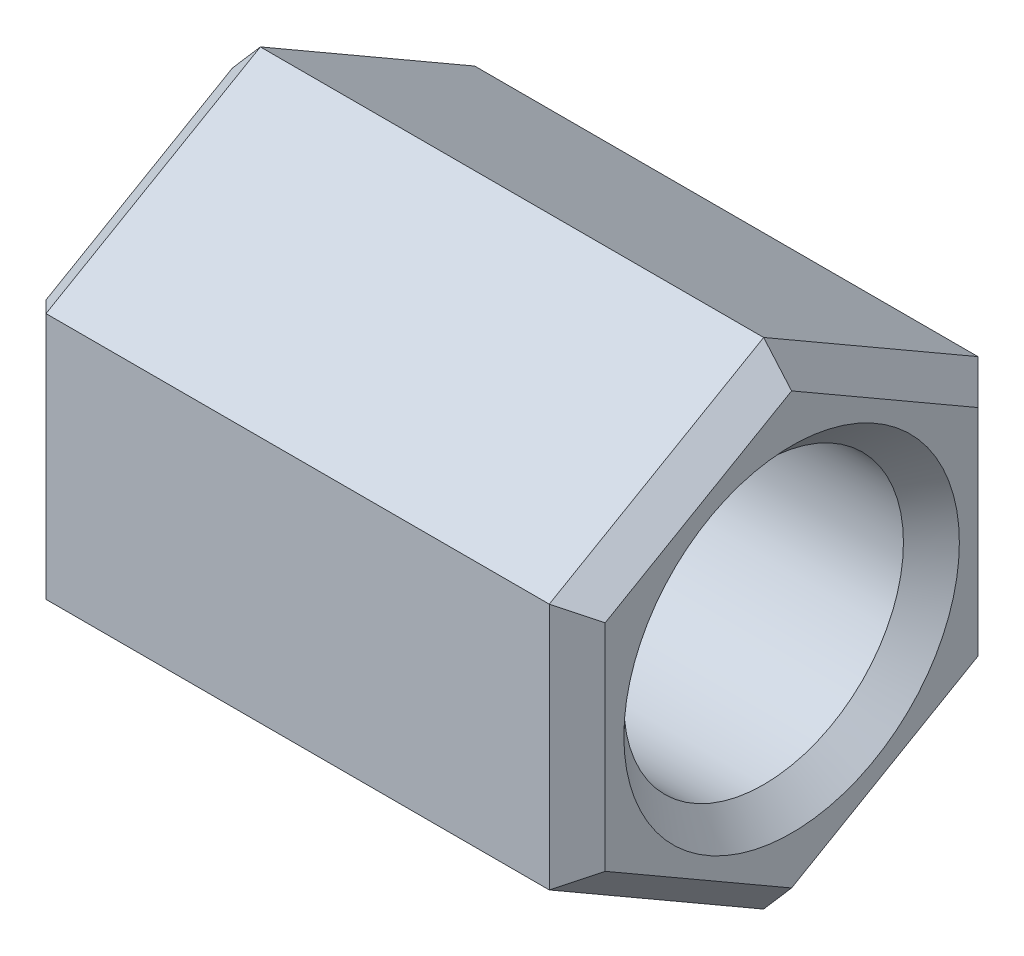
ISO-10303-21;
HEADER;
FILE_DESCRIPTION(('STEP AP214'),'2;1');
FILE_NAME('part.step','',(''),(''),'','','');
FILE_SCHEMA(('AUTOMOTIVE_DESIGN { 1 0 10303 214 1 1 1 1 }'));
ENDSEC;
DATA;
#1=APPLICATION_CONTEXT('core data for automotive mechanical design processes');
#2=APPLICATION_PROTOCOL_DEFINITION('international standard','automotive_design',2000,#1);
#3=PRODUCT_CONTEXT('',#1,'mechanical');
#4=PRODUCT('Part','Part','',(#3));
#5=PRODUCT_RELATED_PRODUCT_CATEGORY('part','',(#4));
#6=PRODUCT_DEFINITION_FORMATION('','',#4);
#7=PRODUCT_DEFINITION_CONTEXT('part definition',#1,'design');
#8=PRODUCT_DEFINITION('design','',#6,#7);
#9=PRODUCT_DEFINITION_SHAPE('','',#8);
#10=(LENGTH_UNIT() NAMED_UNIT(*) SI_UNIT(.MILLI.,.METRE.));
#11=(NAMED_UNIT(*) PLANE_ANGLE_UNIT() SI_UNIT($,.RADIAN.));
#12=(NAMED_UNIT(*) SI_UNIT($,.STERADIAN.) SOLID_ANGLE_UNIT());
#13=UNCERTAINTY_MEASURE_WITH_UNIT(LENGTH_MEASURE(1.E-05),#10,'distance_accuracy_value','');
#14=(GEOMETRIC_REPRESENTATION_CONTEXT(3) GLOBAL_UNCERTAINTY_ASSIGNED_CONTEXT((#13)) GLOBAL_UNIT_ASSIGNED_CONTEXT((#10,
#11,#12)) REPRESENTATION_CONTEXT('',''));
#15=CARTESIAN_POINT('',(0.,0.,0.));
#16=DIRECTION('',(0.,0.,1.));
#17=DIRECTION('',(1.,0.,0.));
#18=AXIS2_PLACEMENT_3D('',#15,#16,#17);
#19=CARTESIAN_POINT('',(6.,0.,0.));
#20=DIRECTION('',(1.,0.,0.));
#21=DIRECTION('',(0.,0.,-1.));
#22=AXIS2_PLACEMENT_3D('',#19,#20,#21);
#23=PLANE('',#22);
#24=CARTESIAN_POINT('',(6.,0.,0.));
#25=DIRECTION('',(1.,0.,0.));
#26=DIRECTION('',(0.,0.,-1.));
#27=AXIS2_PLACEMENT_3D('',#24,#25,#26);
#28=CIRCLE('',#27,1.8);
#29=CARTESIAN_POINT('',(6.,0.,-1.8));
#30=VERTEX_POINT('',#29);
#31=EDGE_CURVE('E11',#30,#30,#28,.F.);
#32=ORIENTED_EDGE('',*,*,#31,.T.);
#33=EDGE_LOOP('',(#32));
#34=FACE_BOUND('',#33,.T.);
#35=DIRECTION('',(0.,0.5,-0.866025403784439));
#36=VECTOR('',#35,1.);
#37=CARTESIAN_POINT('',(6.,-1.06809799800081,-2.15));
#38=LINE('',#37,#36);
#39=CARTESIAN_POINT('',(6.,-2.3094010767585,0.));
#40=VERTEX_POINT('',#39);
#41=CARTESIAN_POINT('',(6.,-1.15470053837925,-2.));
#42=VERTEX_POINT('',#41);
#43=EDGE_CURVE('E63',#40,#42,#38,.T.);
#44=ORIENTED_EDGE('',*,*,#43,.T.);
#45=DIRECTION('',(0.,1.,0.));
#46=VECTOR('',#45,1.);
#47=CARTESIAN_POINT('',(6.,1.32790561913614,-2.));
#48=LINE('',#47,#46);
#49=CARTESIAN_POINT('',(6.,1.15470053837925,-2.));
#50=VERTEX_POINT('',#49);
#51=EDGE_CURVE('E55',#42,#50,#48,.T.);
#52=ORIENTED_EDGE('',*,*,#51,.T.);
#53=DIRECTION('',(0.,0.5,0.866025403784439));
#54=VECTOR('',#53,1.);
#55=CARTESIAN_POINT('',(6.,2.39600361713695,0.15));
#56=LINE('',#55,#54);
#57=CARTESIAN_POINT('',(6.,2.30940107675851,0.));
#58=VERTEX_POINT('',#57);
#59=EDGE_CURVE('E202',#50,#58,#56,.T.);
#60=ORIENTED_EDGE('',*,*,#59,.T.);
#61=DIRECTION('',(0.,-0.5,0.866025403784438));
#62=VECTOR('',#61,1.);
#63=CARTESIAN_POINT('',(6.,1.06809799800081,2.15));
#64=LINE('',#63,#62);
#65=CARTESIAN_POINT('',(6.,1.15470053837925,2.));
#66=VERTEX_POINT('',#65);
#67=EDGE_CURVE('E204',#58,#66,#64,.T.);
#68=ORIENTED_EDGE('',*,*,#67,.T.);
#69=DIRECTION('',(0.,-1.,0.));
#70=VECTOR('',#69,1.);
#71=CARTESIAN_POINT('',(6.,-1.32790561913614,2.));
#72=LINE('',#71,#70);
#73=CARTESIAN_POINT('',(6.,-1.15470053837925,2.));
#74=VERTEX_POINT('',#73);
#75=EDGE_CURVE('E206',#66,#74,#72,.T.);
#76=ORIENTED_EDGE('',*,*,#75,.T.);
#77=DIRECTION('',(0.,-0.5,-0.866025403784439));
#78=VECTOR('',#77,1.);
#79=CARTESIAN_POINT('',(6.,-2.39600361713695,-0.149999999999998));
#80=LINE('',#79,#78);
#81=EDGE_CURVE('E68',#74,#40,#80,.T.);
#82=ORIENTED_EDGE('',*,*,#81,.T.);
#83=EDGE_LOOP('',(#44,#52,#60,#68,#76,#82));
#84=FACE_BOUND('',#83,.T.);
#85=ADVANCED_FACE('F45',(#34,#84),#23,.T.);
#86=CARTESIAN_POINT('',(0.,0.,0.));
#87=DIRECTION('',(1.,0.,0.));
#88=DIRECTION('',(0.,0.,-1.));
#89=AXIS2_PLACEMENT_3D('',#86,#87,#88);
#90=PLANE('',#89);
#91=CARTESIAN_POINT('',(0.,0.,0.));
#92=DIRECTION('',(1.,0.,0.));
#93=DIRECTION('',(0.,0.,-1.));
#94=AXIS2_PLACEMENT_3D('',#91,#92,#93);
#95=CIRCLE('',#94,1.8);
#96=CARTESIAN_POINT('',(0.,0.,-1.8));
#97=VERTEX_POINT('',#96);
#98=EDGE_CURVE('E164',#97,#97,#95,.T.);
#99=ORIENTED_EDGE('',*,*,#98,.T.);
#100=EDGE_LOOP('',(#99));
#101=FACE_BOUND('',#100,.T.);
#102=DIRECTION('',(0.,1.,0.));
#103=VECTOR('',#102,1.);
#104=CARTESIAN_POINT('',(0.,0.,2.));
#105=LINE('',#104,#103);
#106=CARTESIAN_POINT('',(0.,-1.15470053837925,2.));
#107=VERTEX_POINT('',#106);
#108=CARTESIAN_POINT('',(0.,1.15470053837925,2.));
#109=VERTEX_POINT('',#108);
#110=EDGE_CURVE('E163',#107,#109,#105,.T.);
#111=ORIENTED_EDGE('',*,*,#110,.T.);
#112=DIRECTION('',(0.,0.5,-0.866025403784438));
#113=VECTOR('',#112,1.);
#114=CARTESIAN_POINT('',(0.,1.73205080756888,1.));
#115=LINE('',#114,#113);
#116=CARTESIAN_POINT('',(0.,2.3094010767585,0.));
#117=VERTEX_POINT('',#116);
#118=EDGE_CURVE('E142',#109,#117,#115,.T.);
#119=ORIENTED_EDGE('',*,*,#118,.T.);
#120=DIRECTION('',(0.,-0.5,-0.866025403784439));
#121=VECTOR('',#120,1.);
#122=CARTESIAN_POINT('',(0.,1.73205080756888,-1.));
#123=LINE('',#122,#121);
#124=CARTESIAN_POINT('',(0.,1.15470053837925,-2.));
#125=VERTEX_POINT('',#124);
#126=EDGE_CURVE('E152',#117,#125,#123,.T.);
#127=ORIENTED_EDGE('',*,*,#126,.T.);
#128=DIRECTION('',(0.,-1.,0.));
#129=VECTOR('',#128,1.);
#130=CARTESIAN_POINT('',(0.,0.,-2.));
#131=LINE('',#130,#129);
#132=CARTESIAN_POINT('',(0.,-1.15470053837925,-2.));
#133=VERTEX_POINT('',#132);
#134=EDGE_CURVE('E158',#125,#133,#131,.T.);
#135=ORIENTED_EDGE('',*,*,#134,.T.);
#136=DIRECTION('',(0.,-0.5,0.866025403784439));
#137=VECTOR('',#136,1.);
#138=CARTESIAN_POINT('',(0.,-1.73205080756888,-0.999999999999999));
#139=LINE('',#138,#137);
#140=CARTESIAN_POINT('',(0.,-2.3094010767585,0.));
#141=VERTEX_POINT('',#140);
#142=EDGE_CURVE('E264',#133,#141,#139,.T.);
#143=ORIENTED_EDGE('',*,*,#142,.T.);
#144=DIRECTION('',(0.,0.5,0.866025403784439));
#145=VECTOR('',#144,1.);
#146=CARTESIAN_POINT('',(0.,-1.73205080756888,1.));
#147=LINE('',#146,#145);
#148=EDGE_CURVE('E169',#141,#107,#147,.T.);
#149=ORIENTED_EDGE('',*,*,#148,.T.);
#150=EDGE_LOOP('',(#111,#119,#127,#135,#143,#149));
#151=FACE_BOUND('',#150,.T.);
#152=ADVANCED_FACE('F161',(#101,#151),#90,.F.);
#153=CARTESIAN_POINT('',(6.,1.32790561913614,-2.3));
#154=DIRECTION('',(0.,-0.866025403784439,0.5));
#155=DIRECTION('',(0.,-0.5,-0.866025403784439));
#156=AXIS2_PLACEMENT_3D('',#153,#154,#155);
#157=PLANE('',#156);
#158=DIRECTION('',(-1.,0.,0.));
#159=VECTOR('',#158,1.);
#160=CARTESIAN_POINT('',(6.,1.32790561913614,-2.3));
#161=LINE('',#160,#159);
#162=CARTESIAN_POINT('',(5.7,1.32790561913614,-2.3));
#163=VERTEX_POINT('',#162);
#164=CARTESIAN_POINT('',(0.3,1.32790561913614,-2.3));
#165=VERTEX_POINT('',#164);
#166=EDGE_CURVE('E221',#163,#165,#161,.T.);
#167=ORIENTED_EDGE('',*,*,#166,.T.);
#168=DIRECTION('',(0.,0.5,0.866025403784439));
#169=VECTOR('',#168,1.);
#170=CARTESIAN_POINT('',(0.3,1.32790561913614,-2.3));
#171=LINE('',#170,#169);
#172=CARTESIAN_POINT('',(0.3,2.65581123827228,0.));
#173=VERTEX_POINT('',#172);
#174=EDGE_CURVE('E200',#165,#173,#171,.T.);
#175=ORIENTED_EDGE('',*,*,#174,.T.);
#176=DIRECTION('',(-1.,0.,0.));
#177=VECTOR('',#176,1.);
#178=CARTESIAN_POINT('',(6.,2.65581123827228,0.));
#179=LINE('',#178,#177);
#180=CARTESIAN_POINT('',(5.7,2.65581123827228,0.));
#181=VERTEX_POINT('',#180);
#182=EDGE_CURVE('E159',#181,#173,#179,.T.);
#183=ORIENTED_EDGE('',*,*,#182,.F.);
#184=DIRECTION('',(0.,-0.5,-0.866025403784439));
#185=VECTOR('',#184,1.);
#186=CARTESIAN_POINT('',(5.7,1.32790561913614,-2.3));
#187=LINE('',#186,#185);
#188=EDGE_CURVE('E198',#181,#163,#187,.T.);
#189=ORIENTED_EDGE('',*,*,#188,.T.);
#190=EDGE_LOOP('',(#167,#175,#183,#189));
#191=FACE_BOUND('',#190,.T.);
#192=ADVANCED_FACE('F288',(#191),#157,.F.);
#193=CARTESIAN_POINT('',(6.,2.65581123827228,0.));
#194=DIRECTION('',(0.,-0.866025403784438,-0.5));
#195=DIRECTION('',(0.,0.5,-0.866025403784439));
#196=AXIS2_PLACEMENT_3D('',#193,#194,#195);
#197=PLANE('',#196);
#198=ORIENTED_EDGE('',*,*,#182,.T.);
#199=DIRECTION('',(0.,-0.5,0.866025403784439));
#200=VECTOR('',#199,1.);
#201=CARTESIAN_POINT('',(0.3,2.65581123827228,0.));
#202=LINE('',#201,#200);
#203=CARTESIAN_POINT('',(0.3,1.32790561913614,2.3));
#204=VERTEX_POINT('',#203);
#205=EDGE_CURVE('E145',#173,#204,#202,.T.);
#206=ORIENTED_EDGE('',*,*,#205,.T.);
#207=DIRECTION('',(-1.,0.,0.));
#208=VECTOR('',#207,1.);
#209=CARTESIAN_POINT('',(6.,1.32790561913614,2.3));
#210=LINE('',#209,#208);
#211=CARTESIAN_POINT('',(5.7,1.32790561913614,2.3));
#212=VERTEX_POINT('',#211);
#213=EDGE_CURVE('E250',#212,#204,#210,.T.);
#214=ORIENTED_EDGE('',*,*,#213,.F.);
#215=DIRECTION('',(0.,0.5,-0.866025403784439));
#216=VECTOR('',#215,1.);
#217=CARTESIAN_POINT('',(5.7,2.65581123827228,0.));
#218=LINE('',#217,#216);
#219=EDGE_CURVE('E178',#212,#181,#218,.T.);
#220=ORIENTED_EDGE('',*,*,#219,.T.);
#221=EDGE_LOOP('',(#198,#206,#214,#220));
#222=FACE_BOUND('',#221,.T.);
#223=ADVANCED_FACE('F255',(#222),#197,.F.);
#224=CARTESIAN_POINT('',(6.,1.32790561913614,2.3));
#225=DIRECTION('',(0.,0.,-1.));
#226=DIRECTION('',(0.,1.,0.));
#227=AXIS2_PLACEMENT_3D('',#224,#225,#226);
#228=PLANE('',#227);
#229=ORIENTED_EDGE('',*,*,#213,.T.);
#230=DIRECTION('',(0.,-1.,0.));
#231=VECTOR('',#230,1.);
#232=CARTESIAN_POINT('',(0.3,1.32790561913614,2.3));
#233=LINE('',#232,#231);
#234=CARTESIAN_POINT('',(0.3,-1.32790561913614,2.3));
#235=VERTEX_POINT('',#234);
#236=EDGE_CURVE('E183',#204,#235,#233,.T.);
#237=ORIENTED_EDGE('',*,*,#236,.T.);
#238=DIRECTION('',(-1.,0.,0.));
#239=VECTOR('',#238,1.);
#240=CARTESIAN_POINT('',(6.,-1.32790561913614,2.3));
#241=LINE('',#240,#239);
#242=CARTESIAN_POINT('',(5.7,-1.32790561913614,2.3));
#243=VERTEX_POINT('',#242);
#244=EDGE_CURVE('E252',#243,#235,#241,.T.);
#245=ORIENTED_EDGE('',*,*,#244,.F.);
#246=DIRECTION('',(0.,1.,0.));
#247=VECTOR('',#246,1.);
#248=CARTESIAN_POINT('',(5.7,1.32790561913614,2.3));
#249=LINE('',#248,#247);
#250=EDGE_CURVE('E181',#243,#212,#249,.T.);
#251=ORIENTED_EDGE('',*,*,#250,.T.);
#252=EDGE_LOOP('',(#229,#237,#245,#251));
#253=FACE_BOUND('',#252,.T.);
#254=ADVANCED_FACE('F249',(#253),#228,.F.);
#255=CARTESIAN_POINT('',(6.,-1.32790561913614,2.3));
#256=DIRECTION('',(0.,0.866025403784439,-0.5));
#257=DIRECTION('',(0.,0.5,0.866025403784439));
#258=AXIS2_PLACEMENT_3D('',#255,#256,#257);
#259=PLANE('',#258);
#260=ORIENTED_EDGE('',*,*,#244,.T.);
#261=DIRECTION('',(0.,-0.5,-0.866025403784439));
#262=VECTOR('',#261,1.);
#263=CARTESIAN_POINT('',(0.3,-1.32790561913614,2.3));
#264=LINE('',#263,#262);
#265=CARTESIAN_POINT('',(0.3,-2.65581123827228,0.));
#266=VERTEX_POINT('',#265);
#267=EDGE_CURVE('E187',#235,#266,#264,.T.);
#268=ORIENTED_EDGE('',*,*,#267,.T.);
#269=DIRECTION('',(-1.,0.,0.));
#270=VECTOR('',#269,1.);
#271=CARTESIAN_POINT('',(6.,-2.65581123827228,0.));
#272=LINE('',#271,#270);
#273=CARTESIAN_POINT('',(5.7,-2.65581123827228,0.));
#274=VERTEX_POINT('',#273);
#275=EDGE_CURVE('E259',#274,#266,#272,.T.);
#276=ORIENTED_EDGE('',*,*,#275,.F.);
#277=DIRECTION('',(0.,0.5,0.866025403784439));
#278=VECTOR('',#277,1.);
#279=CARTESIAN_POINT('',(5.7,-1.32790561913614,2.3));
#280=LINE('',#279,#278);
#281=EDGE_CURVE('E185',#274,#243,#280,.T.);
#282=ORIENTED_EDGE('',*,*,#281,.T.);
#283=EDGE_LOOP('',(#260,#268,#276,#282));
#284=FACE_BOUND('',#283,.T.);
#285=ADVANCED_FACE('F276',(#284),#259,.F.);
#286=CARTESIAN_POINT('',(6.,-2.65581123827228,0.));
#287=DIRECTION('',(0.,0.866025403784439,0.5));
#288=DIRECTION('',(0.,-0.5,0.866025403784439));
#289=AXIS2_PLACEMENT_3D('',#286,#287,#288);
#290=PLANE('',#289);
#291=ORIENTED_EDGE('',*,*,#275,.T.);
#292=DIRECTION('',(0.,0.5,-0.866025403784439));
#293=VECTOR('',#292,1.);
#294=CARTESIAN_POINT('',(0.3,-2.65581123827228,0.));
#295=LINE('',#294,#293);
#296=CARTESIAN_POINT('',(0.3,-1.32790561913614,-2.3));
#297=VERTEX_POINT('',#296);
#298=EDGE_CURVE('E191',#266,#297,#295,.T.);
#299=ORIENTED_EDGE('',*,*,#298,.T.);
#300=DIRECTION('',(-1.,0.,0.));
#301=VECTOR('',#300,1.);
#302=CARTESIAN_POINT('',(6.,-1.32790561913614,-2.3));
#303=LINE('',#302,#301);
#304=CARTESIAN_POINT('',(5.7,-1.32790561913614,-2.3));
#305=VERTEX_POINT('',#304);
#306=EDGE_CURVE('E281',#305,#297,#303,.T.);
#307=ORIENTED_EDGE('',*,*,#306,.F.);
#308=DIRECTION('',(0.,-0.5,0.866025403784439));
#309=VECTOR('',#308,1.);
#310=CARTESIAN_POINT('',(5.7,-2.65581123827228,0.));
#311=LINE('',#310,#309);
#312=EDGE_CURVE('E189',#305,#274,#311,.T.);
#313=ORIENTED_EDGE('',*,*,#312,.T.);
#314=EDGE_LOOP('',(#291,#299,#307,#313));
#315=FACE_BOUND('',#314,.T.);
#316=ADVANCED_FACE('F299',(#315),#290,.F.);
#317=CARTESIAN_POINT('',(6.,-1.32790561913614,-2.3));
#318=DIRECTION('',(0.,0.,1.));
#319=DIRECTION('',(1.,0.,0.));
#320=AXIS2_PLACEMENT_3D('',#317,#318,#319);
#321=PLANE('',#320);
#322=ORIENTED_EDGE('',*,*,#306,.T.);
#323=DIRECTION('',(0.,1.,0.));
#324=VECTOR('',#323,1.);
#325=CARTESIAN_POINT('',(0.3,-1.32790561913614,-2.3));
#326=LINE('',#325,#324);
#327=EDGE_CURVE('E196',#297,#165,#326,.T.);
#328=ORIENTED_EDGE('',*,*,#327,.T.);
#329=ORIENTED_EDGE('',*,*,#166,.F.);
#330=DIRECTION('',(0.,-1.,0.));
#331=VECTOR('',#330,1.);
#332=CARTESIAN_POINT('',(5.7,-1.32790561913614,-2.3));
#333=LINE('',#332,#331);
#334=EDGE_CURVE('E193',#163,#305,#333,.T.);
#335=ORIENTED_EDGE('',*,*,#334,.T.);
#336=EDGE_LOOP('',(#322,#328,#329,#335));
#337=FACE_BOUND('',#336,.T.);
#338=ADVANCED_FACE('F300',(#337),#321,.F.);
#339=CARTESIAN_POINT('',(6.,0.,0.));
#340=DIRECTION('',(-1.,0.,0.));
#341=DIRECTION('',(0.,0.,1.));
#342=AXIS2_PLACEMENT_3D('',#339,#340,#341);
#343=CYLINDRICAL_SURFACE('',#342,1.5);
#344=CARTESIAN_POINT('',(0.300000000000002,0.,0.));
#345=DIRECTION('',(1.,0.,0.));
#346=DIRECTION('',(0.,0.,-1.));
#347=AXIS2_PLACEMENT_3D('',#344,#345,#346);
#348=CIRCLE('',#347,1.5);
#349=CARTESIAN_POINT('',(0.300000000000002,0.,-1.5));
#350=VERTEX_POINT('',#349);
#351=EDGE_CURVE('E175',#350,#350,#348,.F.);
#352=ORIENTED_EDGE('',*,*,#351,.T.);
#353=EDGE_LOOP('',(#352));
#354=FACE_BOUND('',#353,.T.);
#355=CARTESIAN_POINT('',(5.7,0.,0.));
#356=DIRECTION('',(1.,0.,0.));
#357=DIRECTION('',(0.,0.,-1.));
#358=AXIS2_PLACEMENT_3D('',#355,#356,#357);
#359=CIRCLE('',#358,1.5);
#360=CARTESIAN_POINT('',(5.7,0.,-1.5));
#361=VERTEX_POINT('',#360);
#362=EDGE_CURVE('E167',#361,#361,#359,.T.);
#363=ORIENTED_EDGE('',*,*,#362,.T.);
#364=EDGE_LOOP('',(#363));
#365=FACE_BOUND('',#364,.T.);
#366=ADVANCED_FACE('F319',(#354,#365),#343,.F.);
#367=CARTESIAN_POINT('',(0.,0.,0.));
#368=DIRECTION('',(-1.,0.,0.));
#369=DIRECTION('',(0.,0.,1.));
#370=AXIS2_PLACEMENT_3D('',#367,#368,#369);
#371=CONICAL_SURFACE('',#370,1.8,0.785398163397446);
#372=ORIENTED_EDGE('',*,*,#351,.F.);
#373=EDGE_LOOP('',(#372));
#374=FACE_BOUND('',#373,.T.);
#375=ORIENTED_EDGE('',*,*,#98,.F.);
#376=EDGE_LOOP('',(#375));
#377=FACE_BOUND('',#376,.T.);
#378=ADVANCED_FACE('F334',(#374,#377),#371,.F.);
#379=CARTESIAN_POINT('',(0.3,-2.65581123827228,0.));
#380=DIRECTION('',(0.707106781186549,0.612372435695793,0.353553390593273));
#381=DIRECTION('',(0.,0.5,-0.866025403784439));
#382=AXIS2_PLACEMENT_3D('',#379,#380,#381);
#383=PLANE('',#382);
#384=DIRECTION('',(-0.654653670707976,0.755928946018455,0.));
#385=VECTOR('',#384,1.);
#386=CARTESIAN_POINT('',(0.3,-2.65581123827228,0.));
#387=LINE('',#386,#385);
#388=EDGE_CURVE('E215',#141,#266,#387,.F.);
#389=ORIENTED_EDGE('',*,*,#388,.F.);
#390=ORIENTED_EDGE('',*,*,#142,.F.);
#391=DIRECTION('',(-0.654653670707976,0.377964473009228,0.654653670707978));
#392=VECTOR('',#391,1.);
#393=CARTESIAN_POINT('',(0.3,-1.32790561913614,-2.3));
#394=LINE('',#393,#392);
#395=EDGE_CURVE('E218',#297,#133,#394,.T.);
#396=ORIENTED_EDGE('',*,*,#395,.F.);
#397=ORIENTED_EDGE('',*,*,#298,.F.);
#398=EDGE_LOOP('',(#389,#390,#396,#397));
#399=FACE_BOUND('',#398,.T.);
#400=ADVANCED_FACE('F297',(#399),#383,.F.);
#401=CARTESIAN_POINT('',(0.3,-1.32790561913614,-2.3));
#402=DIRECTION('',(0.707106781186549,0.,0.707106781186547));
#403=DIRECTION('',(0.,1.,0.));
#404=AXIS2_PLACEMENT_3D('',#401,#402,#403);
#405=PLANE('',#404);
#406=ORIENTED_EDGE('',*,*,#395,.T.);
#407=ORIENTED_EDGE('',*,*,#134,.F.);
#408=DIRECTION('',(-0.654653670707976,-0.377964473009228,0.654653670707978));
#409=VECTOR('',#408,1.);
#410=CARTESIAN_POINT('',(0.3,1.32790561913614,-2.3));
#411=LINE('',#410,#409);
#412=EDGE_CURVE('E155',#165,#125,#411,.T.);
#413=ORIENTED_EDGE('',*,*,#412,.F.);
#414=ORIENTED_EDGE('',*,*,#327,.F.);
#415=EDGE_LOOP('',(#406,#407,#413,#414));
#416=FACE_BOUND('',#415,.T.);
#417=ADVANCED_FACE('F294',(#416),#405,.F.);
#418=CARTESIAN_POINT('',(0.3,-1.32790561913614,2.3));
#419=DIRECTION('',(0.707106781186548,0.612372435695794,-0.353553390593273));
#420=DIRECTION('',(0.,-0.5,-0.866025403784439));
#421=AXIS2_PLACEMENT_3D('',#418,#419,#420);
#422=PLANE('',#421);
#423=ORIENTED_EDGE('',*,*,#388,.T.);
#424=ORIENTED_EDGE('',*,*,#267,.F.);
#425=DIRECTION('',(-0.654653670707976,0.377964473009227,-0.654653670707978));
#426=VECTOR('',#425,1.);
#427=CARTESIAN_POINT('',(0.3,-1.32790561913614,2.3));
#428=LINE('',#427,#426);
#429=EDGE_CURVE('E148',#107,#235,#428,.F.);
#430=ORIENTED_EDGE('',*,*,#429,.F.);
#431=ORIENTED_EDGE('',*,*,#148,.F.);
#432=EDGE_LOOP('',(#423,#424,#430,#431));
#433=FACE_BOUND('',#432,.T.);
#434=ADVANCED_FACE('F271',(#433),#422,.F.);
#435=CARTESIAN_POINT('',(0.3,1.32790561913614,-2.3));
#436=DIRECTION('',(0.707106781186549,-0.612372435695794,0.353553390593273));
#437=DIRECTION('',(0.,0.5,0.866025403784439));
#438=AXIS2_PLACEMENT_3D('',#435,#436,#437);
#439=PLANE('',#438);
#440=ORIENTED_EDGE('',*,*,#412,.T.);
#441=ORIENTED_EDGE('',*,*,#126,.F.);
#442=DIRECTION('',(0.654653670707976,0.755928946018456,0.));
#443=VECTOR('',#442,1.);
#444=CARTESIAN_POINT('',(-0.357142857142857,1.89700802733734,0.));
#445=LINE('',#444,#443);
#446=EDGE_CURVE('E138',#173,#117,#445,.F.);
#447=ORIENTED_EDGE('',*,*,#446,.F.);
#448=ORIENTED_EDGE('',*,*,#174,.F.);
#449=EDGE_LOOP('',(#440,#441,#447,#448));
#450=FACE_BOUND('',#449,.T.);
#451=ADVANCED_FACE('F153',(#450),#439,.F.);
#452=CARTESIAN_POINT('',(0.3,1.32790561913614,2.3));
#453=DIRECTION('',(0.707106781186548,0.,-0.707106781186547));
#454=DIRECTION('',(0.,-1.,0.));
#455=AXIS2_PLACEMENT_3D('',#452,#453,#454);
#456=PLANE('',#455);
#457=ORIENTED_EDGE('',*,*,#429,.T.);
#458=ORIENTED_EDGE('',*,*,#236,.F.);
#459=DIRECTION('',(-0.654653670707976,-0.377964473009228,-0.654653670707978));
#460=VECTOR('',#459,1.);
#461=CARTESIAN_POINT('',(0.3,1.32790561913614,2.3));
#462=LINE('',#461,#460);
#463=EDGE_CURVE('E149',#109,#204,#462,.F.);
#464=ORIENTED_EDGE('',*,*,#463,.F.);
#465=ORIENTED_EDGE('',*,*,#110,.F.);
#466=EDGE_LOOP('',(#457,#458,#464,#465));
#467=FACE_BOUND('',#466,.T.);
#468=ADVANCED_FACE('F274',(#467),#456,.F.);
#469=CARTESIAN_POINT('',(0.3,2.65581123827228,0.));
#470=DIRECTION('',(0.707106781186549,-0.612372435695793,-0.353553390593273));
#471=DIRECTION('',(0.,-0.5,0.866025403784439));
#472=AXIS2_PLACEMENT_3D('',#469,#470,#471);
#473=PLANE('',#472);
#474=ORIENTED_EDGE('',*,*,#446,.T.);
#475=ORIENTED_EDGE('',*,*,#118,.F.);
#476=ORIENTED_EDGE('',*,*,#463,.T.);
#477=ORIENTED_EDGE('',*,*,#205,.F.);
#478=EDGE_LOOP('',(#474,#475,#476,#477));
#479=FACE_BOUND('',#478,.T.);
#480=ADVANCED_FACE('F140',(#479),#473,.F.);
#481=CARTESIAN_POINT('',(5.7,0.,0.));
#482=DIRECTION('',(1.,0.,0.));
#483=DIRECTION('',(0.,0.,-1.));
#484=AXIS2_PLACEMENT_3D('',#481,#482,#483);
#485=CONICAL_SURFACE('',#484,1.5,0.785398163397448);
#486=ORIENTED_EDGE('',*,*,#31,.F.);
#487=EDGE_LOOP('',(#486));
#488=FACE_BOUND('',#487,.T.);
#489=ORIENTED_EDGE('',*,*,#362,.F.);
#490=EDGE_LOOP('',(#489));
#491=FACE_BOUND('',#490,.T.);
#492=ADVANCED_FACE('F348',(#488,#491),#485,.F.);
#493=CARTESIAN_POINT('',(6.,0.,2.));
#494=DIRECTION('',(0.707106781186545,0.,0.70710678118655));
#495=DIRECTION('',(0.,1.,0.));
#496=AXIS2_PLACEMENT_3D('',#493,#494,#495);
#497=PLANE('',#496);
#498=DIRECTION('',(0.65465367070798,-0.377964473009226,-0.654653670707976));
#499=VECTOR('',#498,1.);
#500=CARTESIAN_POINT('',(6.28571428571429,0.989743318610789,1.71428571428572));
#501=LINE('',#500,#499);
#502=EDGE_CURVE('E231',#212,#66,#501,.T.);
#503=ORIENTED_EDGE('',*,*,#502,.F.);
#504=ORIENTED_EDGE('',*,*,#250,.F.);
#505=DIRECTION('',(0.65465367070798,0.377964473009226,-0.654653670707975));
#506=VECTOR('',#505,1.);
#507=CARTESIAN_POINT('',(6.28571428571429,-0.989743318610789,1.71428571428572));
#508=LINE('',#507,#506);
#509=EDGE_CURVE('E50',#74,#243,#508,.F.);
#510=ORIENTED_EDGE('',*,*,#509,.F.);
#511=ORIENTED_EDGE('',*,*,#75,.F.);
#512=EDGE_LOOP('',(#503,#504,#510,#511));
#513=FACE_BOUND('',#512,.T.);
#514=ADVANCED_FACE('F48',(#513),#497,.T.);
#515=CARTESIAN_POINT('',(6.,-1.73205080756888,1.));
#516=DIRECTION('',(0.707106781186545,-0.612372435695796,0.353553390593275));
#517=DIRECTION('',(0.,0.5,0.866025403784439));
#518=AXIS2_PLACEMENT_3D('',#515,#516,#517);
#519=PLANE('',#518);
#520=ORIENTED_EDGE('',*,*,#509,.T.);
#521=ORIENTED_EDGE('',*,*,#281,.F.);
#522=DIRECTION('',(0.654653670707979,0.755928946018453,0.));
#523=VECTOR('',#522,1.);
#524=CARTESIAN_POINT('',(6.28571428571429,-1.97948663722158,0.));
#525=LINE('',#524,#523);
#526=EDGE_CURVE('E229',#40,#274,#525,.F.);
#527=ORIENTED_EDGE('',*,*,#526,.F.);
#528=ORIENTED_EDGE('',*,*,#81,.F.);
#529=EDGE_LOOP('',(#520,#521,#527,#528));
#530=FACE_BOUND('',#529,.T.);
#531=ADVANCED_FACE('F241',(#530),#519,.T.);
#532=CARTESIAN_POINT('',(6.,1.73205080756888,1.));
#533=DIRECTION('',(0.707106781186545,0.612372435695797,0.353553390593275));
#534=DIRECTION('',(0.,0.5,-0.866025403784439));
#535=AXIS2_PLACEMENT_3D('',#532,#533,#534);
#536=PLANE('',#535);
#537=ORIENTED_EDGE('',*,*,#502,.T.);
#538=ORIENTED_EDGE('',*,*,#67,.F.);
#539=DIRECTION('',(0.654653670707979,-0.755928946018453,0.));
#540=VECTOR('',#539,1.);
#541=CARTESIAN_POINT('',(6.28571428571429,1.97948663722158,0.));
#542=LINE('',#541,#540);
#543=EDGE_CURVE('E226',#181,#58,#542,.T.);
#544=ORIENTED_EDGE('',*,*,#543,.F.);
#545=ORIENTED_EDGE('',*,*,#219,.F.);
#546=EDGE_LOOP('',(#537,#538,#544,#545));
#547=FACE_BOUND('',#546,.T.);
#548=ADVANCED_FACE('F394',(#547),#536,.T.);
#549=CARTESIAN_POINT('',(6.,-1.73205080756888,-1.));
#550=DIRECTION('',(0.707106781186546,-0.612372435695796,-0.353553390593275));
#551=DIRECTION('',(0.,-0.5,0.866025403784439));
#552=AXIS2_PLACEMENT_3D('',#549,#550,#551);
#553=PLANE('',#552);
#554=ORIENTED_EDGE('',*,*,#526,.T.);
#555=ORIENTED_EDGE('',*,*,#312,.F.);
#556=DIRECTION('',(0.654653670707979,0.377964473009227,0.654653670707975));
#557=VECTOR('',#556,1.);
#558=CARTESIAN_POINT('',(6.28571428571429,-0.989743318610787,-1.71428571428572));
#559=LINE('',#558,#557);
#560=EDGE_CURVE('E224',#42,#305,#559,.F.);
#561=ORIENTED_EDGE('',*,*,#560,.F.);
#562=ORIENTED_EDGE('',*,*,#43,.F.);
#563=EDGE_LOOP('',(#554,#555,#561,#562));
#564=FACE_BOUND('',#563,.T.);
#565=ADVANCED_FACE('F388',(#564),#553,.T.);
#566=CARTESIAN_POINT('',(6.,1.73205080756888,-1.));
#567=DIRECTION('',(0.707106781186546,0.612372435695796,-0.353553390593275));
#568=DIRECTION('',(0.,-0.5,-0.866025403784439));
#569=AXIS2_PLACEMENT_3D('',#566,#567,#568);
#570=PLANE('',#569);
#571=ORIENTED_EDGE('',*,*,#543,.T.);
#572=ORIENTED_EDGE('',*,*,#59,.F.);
#573=DIRECTION('',(-0.654653670707979,0.377964473009227,-0.654653670707975));
#574=VECTOR('',#573,1.);
#575=CARTESIAN_POINT('',(6.28571428571429,0.989743318610789,-1.71428571428572));
#576=LINE('',#575,#574);
#577=EDGE_CURVE('E222',#163,#50,#576,.F.);
#578=ORIENTED_EDGE('',*,*,#577,.F.);
#579=ORIENTED_EDGE('',*,*,#188,.F.);
#580=EDGE_LOOP('',(#571,#572,#578,#579));
#581=FACE_BOUND('',#580,.T.);
#582=ADVANCED_FACE('F308',(#581),#570,.T.);
#583=CARTESIAN_POINT('',(6.,0.,-2.));
#584=DIRECTION('',(0.707106781186545,0.,-0.70710678118655));
#585=DIRECTION('',(0.,-1.,0.));
#586=AXIS2_PLACEMENT_3D('',#583,#584,#585);
#587=PLANE('',#586);
#588=ORIENTED_EDGE('',*,*,#560,.T.);
#589=ORIENTED_EDGE('',*,*,#334,.F.);
#590=ORIENTED_EDGE('',*,*,#577,.T.);
#591=ORIENTED_EDGE('',*,*,#51,.F.);
#592=EDGE_LOOP('',(#588,#589,#590,#591));
#593=FACE_BOUND('',#592,.T.);
#594=ADVANCED_FACE('F303',(#593),#587,.T.);
#595=CLOSED_SHELL('',(#85,#152,#192,#223,#254,#285,#316,#338,#366,#378,#400,#417,#434,#451,#468,
#480,#492,#514,#531,#548,#565,#582,#594));
#596=MANIFOLD_SOLID_BREP('B2',#595);
#597=ADVANCED_BREP_SHAPE_REPRESENTATION('',(#18,#596),#14);
#598=SHAPE_DEFINITION_REPRESENTATION(#9,#597);
ENDSEC;
END-ISO-10303-21;
